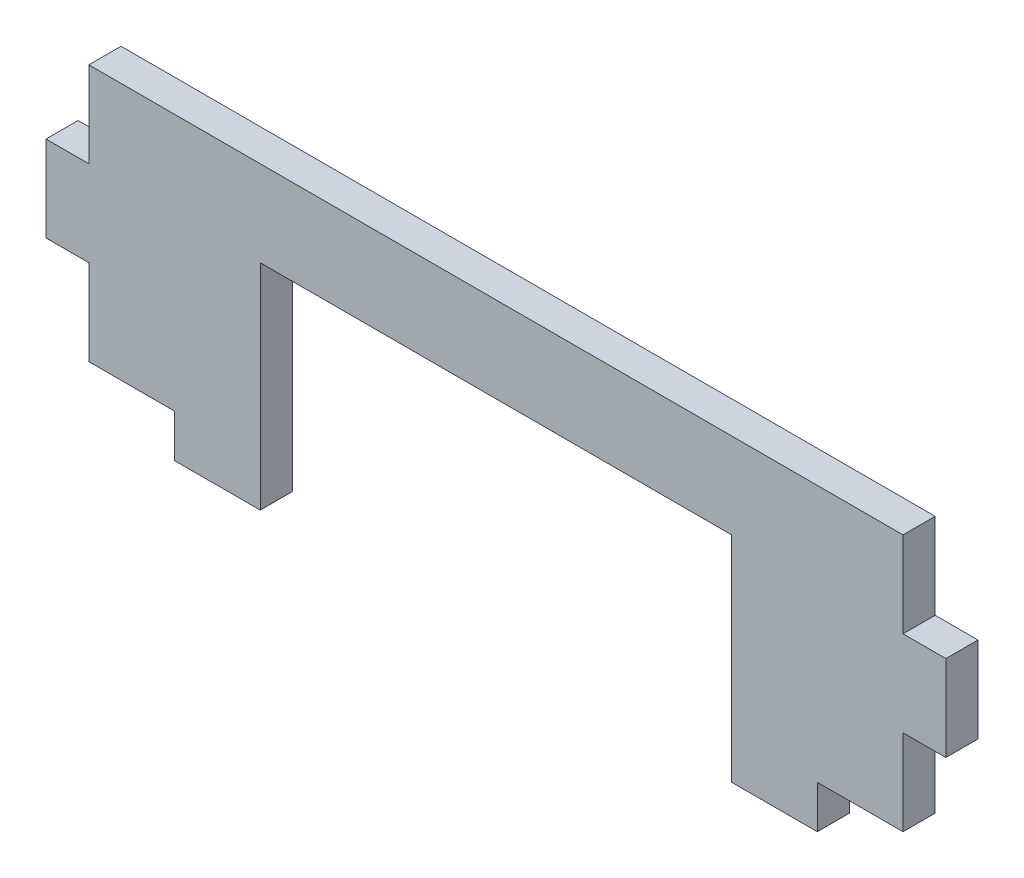
ISO-10303-21;
HEADER;
FILE_DESCRIPTION(('STEP AP214'),'2;1');
FILE_NAME('part.step','',(''),(''),'','','');
FILE_SCHEMA(('AUTOMOTIVE_DESIGN { 1 0 10303 214 1 1 1 1 }'));
ENDSEC;
DATA;
#1=APPLICATION_CONTEXT('core data for automotive mechanical design processes');
#2=APPLICATION_PROTOCOL_DEFINITION('international standard','automotive_design',2000,#1);
#3=PRODUCT_CONTEXT('',#1,'mechanical');
#4=PRODUCT('Part','Part','',(#3));
#5=PRODUCT_RELATED_PRODUCT_CATEGORY('part','',(#4));
#6=PRODUCT_DEFINITION_FORMATION('','',#4);
#7=PRODUCT_DEFINITION_CONTEXT('part definition',#1,'design');
#8=PRODUCT_DEFINITION('design','',#6,#7);
#9=PRODUCT_DEFINITION_SHAPE('','',#8);
#10=(LENGTH_UNIT() NAMED_UNIT(*) SI_UNIT(.MILLI.,.METRE.));
#11=(NAMED_UNIT(*) PLANE_ANGLE_UNIT() SI_UNIT($,.RADIAN.));
#12=(NAMED_UNIT(*) SI_UNIT($,.STERADIAN.) SOLID_ANGLE_UNIT());
#13=UNCERTAINTY_MEASURE_WITH_UNIT(LENGTH_MEASURE(1.E-05),#10,'distance_accuracy_value','');
#14=(GEOMETRIC_REPRESENTATION_CONTEXT(3) GLOBAL_UNCERTAINTY_ASSIGNED_CONTEXT((#13)) GLOBAL_UNIT_ASSIGNED_CONTEXT((#10,
#11,#12)) REPRESENTATION_CONTEXT('',''));
#15=CARTESIAN_POINT('',(0.,0.,0.));
#16=DIRECTION('',(0.,0.,1.));
#17=DIRECTION('',(1.,0.,0.));
#18=AXIS2_PLACEMENT_3D('',#15,#16,#17);
#19=CARTESIAN_POINT('',(-38.,0.,3.));
#20=DIRECTION('',(1.,0.,0.));
#21=DIRECTION('',(0.,0.,-1.));
#22=AXIS2_PLACEMENT_3D('',#19,#20,#21);
#23=PLANE('',#22);
#24=DIRECTION('',(0.,-1.,0.));
#25=VECTOR('',#24,1.);
#26=CARTESIAN_POINT('',(-38.,0.,0.));
#27=LINE('',#26,#25);
#28=CARTESIAN_POINT('',(-38.,0.,0.));
#29=VERTEX_POINT('',#28);
#30=CARTESIAN_POINT('',(-38.,-8.,0.));
#31=VERTEX_POINT('',#30);
#32=EDGE_CURVE('E201',#29,#31,#27,.T.);
#33=ORIENTED_EDGE('',*,*,#32,.T.);
#34=DIRECTION('',(0.,0.,-1.));
#35=VECTOR('',#34,1.);
#36=CARTESIAN_POINT('',(-38.,-8.,3.));
#37=LINE('',#36,#35);
#38=CARTESIAN_POINT('',(-38.,-8.,3.));
#39=VERTEX_POINT('',#38);
#40=EDGE_CURVE('E11',#39,#31,#37,.T.);
#41=ORIENTED_EDGE('',*,*,#40,.F.);
#42=DIRECTION('',(0.,-1.,0.));
#43=VECTOR('',#42,1.);
#44=CARTESIAN_POINT('',(-38.,0.,3.));
#45=LINE('',#44,#43);
#46=CARTESIAN_POINT('',(-38.,0.,3.));
#47=VERTEX_POINT('',#46);
#48=EDGE_CURVE('E241',#47,#39,#45,.T.);
#49=ORIENTED_EDGE('',*,*,#48,.F.);
#50=DIRECTION('',(0.,0.,-1.));
#51=VECTOR('',#50,1.);
#52=CARTESIAN_POINT('',(-38.,0.,3.));
#53=LINE('',#52,#51);
#54=EDGE_CURVE('E197',#47,#29,#53,.T.);
#55=ORIENTED_EDGE('',*,*,#54,.T.);
#56=EDGE_LOOP('',(#33,#41,#49,#55));
#57=FACE_BOUND('',#56,.T.);
#58=ADVANCED_FACE('F33',(#57),#23,.F.);
#59=CARTESIAN_POINT('',(-38.,-8.,3.));
#60=DIRECTION('',(0.,-1.,0.));
#61=DIRECTION('',(1.,0.,0.));
#62=AXIS2_PLACEMENT_3D('',#59,#60,#61);
#63=PLANE('',#62);
#64=DIRECTION('',(-1.,0.,0.));
#65=VECTOR('',#64,1.);
#66=CARTESIAN_POINT('',(-38.,-8.,0.));
#67=LINE('',#66,#65);
#68=CARTESIAN_POINT('',(-42.,-8.,0.));
#69=VERTEX_POINT('',#68);
#70=EDGE_CURVE('E204',#31,#69,#67,.T.);
#71=ORIENTED_EDGE('',*,*,#70,.T.);
#72=DIRECTION('',(0.,0.,-1.));
#73=VECTOR('',#72,1.);
#74=CARTESIAN_POINT('',(-42.,-8.,3.));
#75=LINE('',#74,#73);
#76=CARTESIAN_POINT('',(-42.,-8.,3.));
#77=VERTEX_POINT('',#76);
#78=EDGE_CURVE('E41',#77,#69,#75,.T.);
#79=ORIENTED_EDGE('',*,*,#78,.F.);
#80=DIRECTION('',(-1.,0.,0.));
#81=VECTOR('',#80,1.);
#82=CARTESIAN_POINT('',(-38.,-8.,3.));
#83=LINE('',#82,#81);
#84=EDGE_CURVE('E128',#39,#77,#83,.T.);
#85=ORIENTED_EDGE('',*,*,#84,.F.);
#86=ORIENTED_EDGE('',*,*,#40,.T.);
#87=EDGE_LOOP('',(#71,#79,#85,#86));
#88=FACE_BOUND('',#87,.T.);
#89=ADVANCED_FACE('F359',(#88),#63,.F.);
#90=CARTESIAN_POINT('',(-42.,-8.,3.));
#91=DIRECTION('',(1.,0.,0.));
#92=DIRECTION('',(0.,0.,-1.));
#93=AXIS2_PLACEMENT_3D('',#90,#91,#92);
#94=PLANE('',#93);
#95=DIRECTION('',(0.,-1.,0.));
#96=VECTOR('',#95,1.);
#97=CARTESIAN_POINT('',(-42.,-8.,0.));
#98=LINE('',#97,#96);
#99=CARTESIAN_POINT('',(-42.,-16.,0.));
#100=VERTEX_POINT('',#99);
#101=EDGE_CURVE('E206',#69,#100,#98,.T.);
#102=ORIENTED_EDGE('',*,*,#101,.T.);
#103=DIRECTION('',(0.,0.,-1.));
#104=VECTOR('',#103,1.);
#105=CARTESIAN_POINT('',(-42.,-16.,3.));
#106=LINE('',#105,#104);
#107=CARTESIAN_POINT('',(-42.,-16.,3.));
#108=VERTEX_POINT('',#107);
#109=EDGE_CURVE('E284',#108,#100,#106,.T.);
#110=ORIENTED_EDGE('',*,*,#109,.F.);
#111=DIRECTION('',(0.,-1.,0.));
#112=VECTOR('',#111,1.);
#113=CARTESIAN_POINT('',(-42.,-8.,3.));
#114=LINE('',#113,#112);
#115=EDGE_CURVE('E292',#77,#108,#114,.T.);
#116=ORIENTED_EDGE('',*,*,#115,.F.);
#117=ORIENTED_EDGE('',*,*,#78,.T.);
#118=EDGE_LOOP('',(#102,#110,#116,#117));
#119=FACE_BOUND('',#118,.T.);
#120=ADVANCED_FACE('F290',(#119),#94,.F.);
#121=CARTESIAN_POINT('',(-42.,-16.,3.));
#122=DIRECTION('',(0.,1.,0.));
#123=DIRECTION('',(-1.,0.,0.));
#124=AXIS2_PLACEMENT_3D('',#121,#122,#123);
#125=PLANE('',#124);
#126=DIRECTION('',(1.,0.,0.));
#127=VECTOR('',#126,1.);
#128=CARTESIAN_POINT('',(-42.,-16.,0.));
#129=LINE('',#128,#127);
#130=CARTESIAN_POINT('',(-38.,-16.,0.));
#131=VERTEX_POINT('',#130);
#132=EDGE_CURVE('E208',#100,#131,#129,.T.);
#133=ORIENTED_EDGE('',*,*,#132,.T.);
#134=DIRECTION('',(0.,0.,-1.));
#135=VECTOR('',#134,1.);
#136=CARTESIAN_POINT('',(-38.,-16.,3.));
#137=LINE('',#136,#135);
#138=CARTESIAN_POINT('',(-38.,-16.,3.));
#139=VERTEX_POINT('',#138);
#140=EDGE_CURVE('E281',#139,#131,#137,.T.);
#141=ORIENTED_EDGE('',*,*,#140,.F.);
#142=DIRECTION('',(1.,0.,0.));
#143=VECTOR('',#142,1.);
#144=CARTESIAN_POINT('',(-42.,-16.,3.));
#145=LINE('',#144,#143);
#146=EDGE_CURVE('E310',#108,#139,#145,.T.);
#147=ORIENTED_EDGE('',*,*,#146,.F.);
#148=ORIENTED_EDGE('',*,*,#109,.T.);
#149=EDGE_LOOP('',(#133,#141,#147,#148));
#150=FACE_BOUND('',#149,.T.);
#151=ADVANCED_FACE('F301',(#150),#125,.F.);
#152=CARTESIAN_POINT('',(-38.,-16.,3.));
#153=DIRECTION('',(1.,0.,0.));
#154=DIRECTION('',(0.,1.,0.));
#155=AXIS2_PLACEMENT_3D('',#152,#153,#154);
#156=PLANE('',#155);
#157=DIRECTION('',(0.,-1.,0.));
#158=VECTOR('',#157,1.);
#159=CARTESIAN_POINT('',(-38.,-16.,0.));
#160=LINE('',#159,#158);
#161=CARTESIAN_POINT('',(-38.,-24.,0.));
#162=VERTEX_POINT('',#161);
#163=EDGE_CURVE('E210',#131,#162,#160,.T.);
#164=ORIENTED_EDGE('',*,*,#163,.T.);
#165=DIRECTION('',(0.,0.,-1.));
#166=VECTOR('',#165,1.);
#167=CARTESIAN_POINT('',(-38.,-24.,3.));
#168=LINE('',#167,#166);
#169=CARTESIAN_POINT('',(-38.,-24.,3.));
#170=VERTEX_POINT('',#169);
#171=EDGE_CURVE('E278',#170,#162,#168,.T.);
#172=ORIENTED_EDGE('',*,*,#171,.F.);
#173=DIRECTION('',(0.,-1.,0.));
#174=VECTOR('',#173,1.);
#175=CARTESIAN_POINT('',(-38.,-16.,3.));
#176=LINE('',#175,#174);
#177=EDGE_CURVE('E307',#139,#170,#176,.T.);
#178=ORIENTED_EDGE('',*,*,#177,.F.);
#179=ORIENTED_EDGE('',*,*,#140,.T.);
#180=EDGE_LOOP('',(#164,#172,#178,#179));
#181=FACE_BOUND('',#180,.T.);
#182=ADVANCED_FACE('F305',(#181),#156,.F.);
#183=CARTESIAN_POINT('',(-38.,-24.,3.));
#184=DIRECTION('',(0.,1.,0.));
#185=DIRECTION('',(0.,0.,1.));
#186=AXIS2_PLACEMENT_3D('',#183,#184,#185);
#187=PLANE('',#186);
#188=DIRECTION('',(1.,0.,0.));
#189=VECTOR('',#188,1.);
#190=CARTESIAN_POINT('',(-38.,-24.,0.));
#191=LINE('',#190,#189);
#192=CARTESIAN_POINT('',(-30.,-24.,0.));
#193=VERTEX_POINT('',#192);
#194=EDGE_CURVE('E212',#162,#193,#191,.T.);
#195=ORIENTED_EDGE('',*,*,#194,.T.);
#196=DIRECTION('',(0.,0.,-1.));
#197=VECTOR('',#196,1.);
#198=CARTESIAN_POINT('',(-30.,-24.,3.));
#199=LINE('',#198,#197);
#200=CARTESIAN_POINT('',(-30.,-24.,3.));
#201=VERTEX_POINT('',#200);
#202=EDGE_CURVE('E275',#201,#193,#199,.T.);
#203=ORIENTED_EDGE('',*,*,#202,.F.);
#204=DIRECTION('',(1.,0.,0.));
#205=VECTOR('',#204,1.);
#206=CARTESIAN_POINT('',(-38.,-24.,3.));
#207=LINE('',#206,#205);
#208=EDGE_CURVE('E309',#170,#201,#207,.T.);
#209=ORIENTED_EDGE('',*,*,#208,.F.);
#210=ORIENTED_EDGE('',*,*,#171,.T.);
#211=EDGE_LOOP('',(#195,#203,#209,#210));
#212=FACE_BOUND('',#211,.T.);
#213=ADVANCED_FACE('F372',(#212),#187,.F.);
#214=CARTESIAN_POINT('',(-30.,-24.,3.));
#215=DIRECTION('',(1.,0.,0.));
#216=DIRECTION('',(0.,0.,-1.));
#217=AXIS2_PLACEMENT_3D('',#214,#215,#216);
#218=PLANE('',#217);
#219=DIRECTION('',(0.,-1.,0.));
#220=VECTOR('',#219,1.);
#221=CARTESIAN_POINT('',(-30.,-24.,0.));
#222=LINE('',#221,#220);
#223=CARTESIAN_POINT('',(-30.,-28.,0.));
#224=VERTEX_POINT('',#223);
#225=EDGE_CURVE('E214',#193,#224,#222,.T.);
#226=ORIENTED_EDGE('',*,*,#225,.T.);
#227=DIRECTION('',(0.,0.,-1.));
#228=VECTOR('',#227,1.);
#229=CARTESIAN_POINT('',(-30.,-28.,3.));
#230=LINE('',#229,#228);
#231=CARTESIAN_POINT('',(-30.,-28.,3.));
#232=VERTEX_POINT('',#231);
#233=EDGE_CURVE('E272',#232,#224,#230,.T.);
#234=ORIENTED_EDGE('',*,*,#233,.F.);
#235=DIRECTION('',(0.,-1.,0.));
#236=VECTOR('',#235,1.);
#237=CARTESIAN_POINT('',(-30.,-24.,3.));
#238=LINE('',#237,#236);
#239=EDGE_CURVE('E312',#201,#232,#238,.T.);
#240=ORIENTED_EDGE('',*,*,#239,.F.);
#241=ORIENTED_EDGE('',*,*,#202,.T.);
#242=EDGE_LOOP('',(#226,#234,#240,#241));
#243=FACE_BOUND('',#242,.T.);
#244=ADVANCED_FACE('F375',(#243),#218,.F.);
#245=CARTESIAN_POINT('',(-30.,-28.,3.));
#246=DIRECTION('',(0.,1.,0.));
#247=DIRECTION('',(0.,0.,1.));
#248=AXIS2_PLACEMENT_3D('',#245,#246,#247);
#249=PLANE('',#248);
#250=DIRECTION('',(1.,0.,0.));
#251=VECTOR('',#250,1.);
#252=CARTESIAN_POINT('',(-30.,-28.,0.));
#253=LINE('',#252,#251);
#254=CARTESIAN_POINT('',(-22.,-28.,0.));
#255=VERTEX_POINT('',#254);
#256=EDGE_CURVE('E216',#224,#255,#253,.T.);
#257=ORIENTED_EDGE('',*,*,#256,.T.);
#258=DIRECTION('',(0.,0.,-1.));
#259=VECTOR('',#258,1.);
#260=CARTESIAN_POINT('',(-22.,-28.,3.));
#261=LINE('',#260,#259);
#262=CARTESIAN_POINT('',(-22.,-28.,3.));
#263=VERTEX_POINT('',#262);
#264=EDGE_CURVE('E269',#263,#255,#261,.T.);
#265=ORIENTED_EDGE('',*,*,#264,.F.);
#266=DIRECTION('',(1.,0.,0.));
#267=VECTOR('',#266,1.);
#268=CARTESIAN_POINT('',(-30.,-28.,3.));
#269=LINE('',#268,#267);
#270=EDGE_CURVE('E318',#232,#263,#269,.T.);
#271=ORIENTED_EDGE('',*,*,#270,.F.);
#272=ORIENTED_EDGE('',*,*,#233,.T.);
#273=EDGE_LOOP('',(#257,#265,#271,#272));
#274=FACE_BOUND('',#273,.T.);
#275=ADVANCED_FACE('F379',(#274),#249,.F.);
#276=CARTESIAN_POINT('',(-22.,-16.,3.));
#277=DIRECTION('',(-1.,0.,0.));
#278=DIRECTION('',(0.,0.,1.));
#279=AXIS2_PLACEMENT_3D('',#276,#277,#278);
#280=PLANE('',#279);
#281=DIRECTION('',(0.,1.,0.));
#282=VECTOR('',#281,1.);
#283=CARTESIAN_POINT('',(-22.,-16.,0.));
#284=LINE('',#283,#282);
#285=CARTESIAN_POINT('',(-22.,-8.,0.));
#286=VERTEX_POINT('',#285);
#287=EDGE_CURVE('E219',#255,#286,#284,.T.);
#288=ORIENTED_EDGE('',*,*,#287,.T.);
#289=DIRECTION('',(0.,0.,-1.));
#290=VECTOR('',#289,1.);
#291=CARTESIAN_POINT('',(-22.,-8.,3.));
#292=LINE('',#291,#290);
#293=CARTESIAN_POINT('',(-22.,-8.,3.));
#294=VERTEX_POINT('',#293);
#295=EDGE_CURVE('E266',#294,#286,#292,.T.);
#296=ORIENTED_EDGE('',*,*,#295,.F.);
#297=DIRECTION('',(0.,1.,0.));
#298=VECTOR('',#297,1.);
#299=CARTESIAN_POINT('',(-22.,-28.,3.));
#300=LINE('',#299,#298);
#301=EDGE_CURVE('E320',#263,#294,#300,.T.);
#302=ORIENTED_EDGE('',*,*,#301,.F.);
#303=ORIENTED_EDGE('',*,*,#264,.T.);
#304=EDGE_LOOP('',(#288,#296,#302,#303));
#305=FACE_BOUND('',#304,.T.);
#306=ADVANCED_FACE('F383',(#305),#280,.F.);
#307=CARTESIAN_POINT('',(22.,-8.,3.));
#308=DIRECTION('',(0.,1.,0.));
#309=DIRECTION('',(0.,0.,1.));
#310=AXIS2_PLACEMENT_3D('',#307,#308,#309);
#311=PLANE('',#310);
#312=DIRECTION('',(1.,0.,0.));
#313=VECTOR('',#312,1.);
#314=CARTESIAN_POINT('',(22.,-8.,0.));
#315=LINE('',#314,#313);
#316=CARTESIAN_POINT('',(22.,-8.,0.));
#317=VERTEX_POINT('',#316);
#318=EDGE_CURVE('E221',#286,#317,#315,.T.);
#319=ORIENTED_EDGE('',*,*,#318,.T.);
#320=DIRECTION('',(0.,0.,-1.));
#321=VECTOR('',#320,1.);
#322=CARTESIAN_POINT('',(22.,-8.,3.));
#323=LINE('',#322,#321);
#324=CARTESIAN_POINT('',(22.,-8.,3.));
#325=VERTEX_POINT('',#324);
#326=EDGE_CURVE('E263',#325,#317,#323,.T.);
#327=ORIENTED_EDGE('',*,*,#326,.F.);
#328=DIRECTION('',(1.,0.,0.));
#329=VECTOR('',#328,1.);
#330=CARTESIAN_POINT('',(22.,-8.,3.));
#331=LINE('',#330,#329);
#332=EDGE_CURVE('E322',#294,#325,#331,.T.);
#333=ORIENTED_EDGE('',*,*,#332,.F.);
#334=ORIENTED_EDGE('',*,*,#295,.T.);
#335=EDGE_LOOP('',(#319,#327,#333,#334));
#336=FACE_BOUND('',#335,.T.);
#337=ADVANCED_FACE('F387',(#336),#311,.F.);
#338=CARTESIAN_POINT('',(22.,-28.,3.));
#339=DIRECTION('',(1.,0.,0.));
#340=DIRECTION('',(0.,0.,-1.));
#341=AXIS2_PLACEMENT_3D('',#338,#339,#340);
#342=PLANE('',#341);
#343=DIRECTION('',(0.,-1.,0.));
#344=VECTOR('',#343,1.);
#345=CARTESIAN_POINT('',(22.,-28.,0.));
#346=LINE('',#345,#344);
#347=CARTESIAN_POINT('',(22.,-28.,0.));
#348=VERTEX_POINT('',#347);
#349=EDGE_CURVE('E224',#317,#348,#346,.T.);
#350=ORIENTED_EDGE('',*,*,#349,.T.);
#351=DIRECTION('',(0.,0.,-1.));
#352=VECTOR('',#351,1.);
#353=CARTESIAN_POINT('',(22.,-28.,3.));
#354=LINE('',#353,#352);
#355=CARTESIAN_POINT('',(22.,-28.,3.));
#356=VERTEX_POINT('',#355);
#357=EDGE_CURVE('E260',#356,#348,#354,.T.);
#358=ORIENTED_EDGE('',*,*,#357,.F.);
#359=DIRECTION('',(0.,-1.,0.));
#360=VECTOR('',#359,1.);
#361=CARTESIAN_POINT('',(22.,-16.,3.));
#362=LINE('',#361,#360);
#363=EDGE_CURVE('E324',#325,#356,#362,.T.);
#364=ORIENTED_EDGE('',*,*,#363,.F.);
#365=ORIENTED_EDGE('',*,*,#326,.T.);
#366=EDGE_LOOP('',(#350,#358,#364,#365));
#367=FACE_BOUND('',#366,.T.);
#368=ADVANCED_FACE('F391',(#367),#342,.F.);
#369=CARTESIAN_POINT('',(30.,-28.,3.));
#370=DIRECTION('',(0.,1.,0.));
#371=DIRECTION('',(0.,0.,1.));
#372=AXIS2_PLACEMENT_3D('',#369,#370,#371);
#373=PLANE('',#372);
#374=DIRECTION('',(1.,0.,0.));
#375=VECTOR('',#374,1.);
#376=CARTESIAN_POINT('',(30.,-28.,0.));
#377=LINE('',#376,#375);
#378=CARTESIAN_POINT('',(30.,-28.,0.));
#379=VERTEX_POINT('',#378);
#380=EDGE_CURVE('E226',#348,#379,#377,.T.);
#381=ORIENTED_EDGE('',*,*,#380,.T.);
#382=DIRECTION('',(0.,0.,-1.));
#383=VECTOR('',#382,1.);
#384=CARTESIAN_POINT('',(30.,-28.,3.));
#385=LINE('',#384,#383);
#386=CARTESIAN_POINT('',(30.,-28.,3.));
#387=VERTEX_POINT('',#386);
#388=EDGE_CURVE('E257',#387,#379,#385,.T.);
#389=ORIENTED_EDGE('',*,*,#388,.F.);
#390=DIRECTION('',(1.,0.,0.));
#391=VECTOR('',#390,1.);
#392=CARTESIAN_POINT('',(30.,-28.,3.));
#393=LINE('',#392,#391);
#394=EDGE_CURVE('E326',#356,#387,#393,.T.);
#395=ORIENTED_EDGE('',*,*,#394,.F.);
#396=ORIENTED_EDGE('',*,*,#357,.T.);
#397=EDGE_LOOP('',(#381,#389,#395,#396));
#398=FACE_BOUND('',#397,.T.);
#399=ADVANCED_FACE('F395',(#398),#373,.F.);
#400=CARTESIAN_POINT('',(30.,-24.,3.));
#401=DIRECTION('',(-1.,0.,0.));
#402=DIRECTION('',(0.,0.,1.));
#403=AXIS2_PLACEMENT_3D('',#400,#401,#402);
#404=PLANE('',#403);
#405=DIRECTION('',(0.,1.,0.));
#406=VECTOR('',#405,1.);
#407=CARTESIAN_POINT('',(30.,-24.,0.));
#408=LINE('',#407,#406);
#409=CARTESIAN_POINT('',(30.,-24.,0.));
#410=VERTEX_POINT('',#409);
#411=EDGE_CURVE('E228',#379,#410,#408,.T.);
#412=ORIENTED_EDGE('',*,*,#411,.T.);
#413=DIRECTION('',(0.,0.,-1.));
#414=VECTOR('',#413,1.);
#415=CARTESIAN_POINT('',(30.,-24.,3.));
#416=LINE('',#415,#414);
#417=CARTESIAN_POINT('',(30.,-24.,3.));
#418=VERTEX_POINT('',#417);
#419=EDGE_CURVE('E254',#418,#410,#416,.T.);
#420=ORIENTED_EDGE('',*,*,#419,.F.);
#421=DIRECTION('',(0.,1.,0.));
#422=VECTOR('',#421,1.);
#423=CARTESIAN_POINT('',(30.,-24.,3.));
#424=LINE('',#423,#422);
#425=EDGE_CURVE('E328',#387,#418,#424,.T.);
#426=ORIENTED_EDGE('',*,*,#425,.F.);
#427=ORIENTED_EDGE('',*,*,#388,.T.);
#428=EDGE_LOOP('',(#412,#420,#426,#427));
#429=FACE_BOUND('',#428,.T.);
#430=ADVANCED_FACE('F399',(#429),#404,.F.);
#431=CARTESIAN_POINT('',(38.,-24.,3.));
#432=DIRECTION('',(0.,1.,0.));
#433=DIRECTION('',(0.,0.,1.));
#434=AXIS2_PLACEMENT_3D('',#431,#432,#433);
#435=PLANE('',#434);
#436=DIRECTION('',(1.,0.,0.));
#437=VECTOR('',#436,1.);
#438=CARTESIAN_POINT('',(38.,-24.,0.));
#439=LINE('',#438,#437);
#440=CARTESIAN_POINT('',(38.,-24.,0.));
#441=VERTEX_POINT('',#440);
#442=EDGE_CURVE('E230',#410,#441,#439,.T.);
#443=ORIENTED_EDGE('',*,*,#442,.T.);
#444=DIRECTION('',(0.,0.,-1.));
#445=VECTOR('',#444,1.);
#446=CARTESIAN_POINT('',(38.,-24.,3.));
#447=LINE('',#446,#445);
#448=CARTESIAN_POINT('',(38.,-24.,3.));
#449=VERTEX_POINT('',#448);
#450=EDGE_CURVE('E251',#449,#441,#447,.T.);
#451=ORIENTED_EDGE('',*,*,#450,.F.);
#452=DIRECTION('',(1.,0.,0.));
#453=VECTOR('',#452,1.);
#454=CARTESIAN_POINT('',(38.,-24.,3.));
#455=LINE('',#454,#453);
#456=EDGE_CURVE('E330',#418,#449,#455,.T.);
#457=ORIENTED_EDGE('',*,*,#456,.F.);
#458=ORIENTED_EDGE('',*,*,#419,.T.);
#459=EDGE_LOOP('',(#443,#451,#457,#458));
#460=FACE_BOUND('',#459,.T.);
#461=ADVANCED_FACE('F403',(#460),#435,.F.);
#462=CARTESIAN_POINT('',(38.,-16.,3.));
#463=DIRECTION('',(-1.,0.,0.));
#464=DIRECTION('',(0.,-1.,0.));
#465=AXIS2_PLACEMENT_3D('',#462,#463,#464);
#466=PLANE('',#465);
#467=DIRECTION('',(0.,1.,0.));
#468=VECTOR('',#467,1.);
#469=CARTESIAN_POINT('',(38.,-16.,0.));
#470=LINE('',#469,#468);
#471=CARTESIAN_POINT('',(38.,-16.,0.));
#472=VERTEX_POINT('',#471);
#473=EDGE_CURVE('E232',#441,#472,#470,.T.);
#474=ORIENTED_EDGE('',*,*,#473,.T.);
#475=DIRECTION('',(0.,0.,-1.));
#476=VECTOR('',#475,1.);
#477=CARTESIAN_POINT('',(38.,-16.,3.));
#478=LINE('',#477,#476);
#479=CARTESIAN_POINT('',(38.,-16.,3.));
#480=VERTEX_POINT('',#479);
#481=EDGE_CURVE('E248',#480,#472,#478,.T.);
#482=ORIENTED_EDGE('',*,*,#481,.F.);
#483=DIRECTION('',(0.,1.,0.));
#484=VECTOR('',#483,1.);
#485=CARTESIAN_POINT('',(38.,-16.,3.));
#486=LINE('',#485,#484);
#487=EDGE_CURVE('E332',#449,#480,#486,.T.);
#488=ORIENTED_EDGE('',*,*,#487,.F.);
#489=ORIENTED_EDGE('',*,*,#450,.T.);
#490=EDGE_LOOP('',(#474,#482,#488,#489));
#491=FACE_BOUND('',#490,.T.);
#492=ADVANCED_FACE('F407',(#491),#466,.F.);
#493=CARTESIAN_POINT('',(42.,-16.,3.));
#494=DIRECTION('',(0.,1.,0.));
#495=DIRECTION('',(-1.,0.,0.));
#496=AXIS2_PLACEMENT_3D('',#493,#494,#495);
#497=PLANE('',#496);
#498=DIRECTION('',(1.,0.,0.));
#499=VECTOR('',#498,1.);
#500=CARTESIAN_POINT('',(42.,-16.,0.));
#501=LINE('',#500,#499);
#502=CARTESIAN_POINT('',(42.,-16.,0.));
#503=VERTEX_POINT('',#502);
#504=EDGE_CURVE('E234',#472,#503,#501,.T.);
#505=ORIENTED_EDGE('',*,*,#504,.T.);
#506=DIRECTION('',(0.,0.,-1.));
#507=VECTOR('',#506,1.);
#508=CARTESIAN_POINT('',(42.,-16.,3.));
#509=LINE('',#508,#507);
#510=CARTESIAN_POINT('',(42.,-16.,3.));
#511=VERTEX_POINT('',#510);
#512=EDGE_CURVE('E245',#511,#503,#509,.T.);
#513=ORIENTED_EDGE('',*,*,#512,.F.);
#514=DIRECTION('',(1.,0.,0.));
#515=VECTOR('',#514,1.);
#516=CARTESIAN_POINT('',(42.,-16.,3.));
#517=LINE('',#516,#515);
#518=EDGE_CURVE('E334',#480,#511,#517,.T.);
#519=ORIENTED_EDGE('',*,*,#518,.F.);
#520=ORIENTED_EDGE('',*,*,#481,.T.);
#521=EDGE_LOOP('',(#505,#513,#519,#520));
#522=FACE_BOUND('',#521,.T.);
#523=ADVANCED_FACE('F340',(#522),#497,.F.);
#524=CARTESIAN_POINT('',(42.,-8.,3.));
#525=DIRECTION('',(-1.,0.,0.));
#526=DIRECTION('',(0.,0.,1.));
#527=AXIS2_PLACEMENT_3D('',#524,#525,#526);
#528=PLANE('',#527);
#529=DIRECTION('',(0.,1.,0.));
#530=VECTOR('',#529,1.);
#531=CARTESIAN_POINT('',(42.,-8.,0.));
#532=LINE('',#531,#530);
#533=CARTESIAN_POINT('',(42.,-8.,0.));
#534=VERTEX_POINT('',#533);
#535=EDGE_CURVE('E236',#503,#534,#532,.T.);
#536=ORIENTED_EDGE('',*,*,#535,.T.);
#537=DIRECTION('',(0.,0.,-1.));
#538=VECTOR('',#537,1.);
#539=CARTESIAN_POINT('',(42.,-8.,3.));
#540=LINE('',#539,#538);
#541=CARTESIAN_POINT('',(42.,-8.,3.));
#542=VERTEX_POINT('',#541);
#543=EDGE_CURVE('E192',#542,#534,#540,.T.);
#544=ORIENTED_EDGE('',*,*,#543,.F.);
#545=DIRECTION('',(0.,1.,0.));
#546=VECTOR('',#545,1.);
#547=CARTESIAN_POINT('',(42.,-8.,3.));
#548=LINE('',#547,#546);
#549=EDGE_CURVE('E183',#511,#542,#548,.T.);
#550=ORIENTED_EDGE('',*,*,#549,.F.);
#551=ORIENTED_EDGE('',*,*,#512,.T.);
#552=EDGE_LOOP('',(#536,#544,#550,#551));
#553=FACE_BOUND('',#552,.T.);
#554=ADVANCED_FACE('F344',(#553),#528,.F.);
#555=CARTESIAN_POINT('',(38.,-8.,3.));
#556=DIRECTION('',(0.,-1.,0.));
#557=DIRECTION('',(1.,0.,0.));
#558=AXIS2_PLACEMENT_3D('',#555,#556,#557);
#559=PLANE('',#558);
#560=DIRECTION('',(-1.,0.,0.));
#561=VECTOR('',#560,1.);
#562=CARTESIAN_POINT('',(38.,-8.,0.));
#563=LINE('',#562,#561);
#564=CARTESIAN_POINT('',(38.,-8.,0.));
#565=VERTEX_POINT('',#564);
#566=EDGE_CURVE('E191',#534,#565,#563,.T.);
#567=ORIENTED_EDGE('',*,*,#566,.T.);
#568=DIRECTION('',(0.,0.,-1.));
#569=VECTOR('',#568,1.);
#570=CARTESIAN_POINT('',(38.,-8.,3.));
#571=LINE('',#570,#569);
#572=CARTESIAN_POINT('',(38.,-8.,3.));
#573=VERTEX_POINT('',#572);
#574=EDGE_CURVE('E188',#573,#565,#571,.T.);
#575=ORIENTED_EDGE('',*,*,#574,.F.);
#576=DIRECTION('',(-1.,0.,0.));
#577=VECTOR('',#576,1.);
#578=CARTESIAN_POINT('',(38.,-8.,3.));
#579=LINE('',#578,#577);
#580=EDGE_CURVE('E177',#542,#573,#579,.T.);
#581=ORIENTED_EDGE('',*,*,#580,.F.);
#582=ORIENTED_EDGE('',*,*,#543,.T.);
#583=EDGE_LOOP('',(#567,#575,#581,#582));
#584=FACE_BOUND('',#583,.T.);
#585=ADVANCED_FACE('F189',(#584),#559,.F.);
#586=CARTESIAN_POINT('',(38.,0.,3.));
#587=DIRECTION('',(-1.,0.,0.));
#588=DIRECTION('',(0.,0.,1.));
#589=AXIS2_PLACEMENT_3D('',#586,#587,#588);
#590=PLANE('',#589);
#591=DIRECTION('',(0.,1.,0.));
#592=VECTOR('',#591,1.);
#593=CARTESIAN_POINT('',(38.,0.,0.));
#594=LINE('',#593,#592);
#595=CARTESIAN_POINT('',(38.,0.,0.));
#596=VERTEX_POINT('',#595);
#597=EDGE_CURVE('E114',#565,#596,#594,.T.);
#598=ORIENTED_EDGE('',*,*,#597,.T.);
#599=DIRECTION('',(0.,0.,-1.));
#600=VECTOR('',#599,1.);
#601=CARTESIAN_POINT('',(38.,0.,3.));
#602=LINE('',#601,#600);
#603=CARTESIAN_POINT('',(38.,0.,3.));
#604=VERTEX_POINT('',#603);
#605=EDGE_CURVE('E193',#604,#596,#602,.T.);
#606=ORIENTED_EDGE('',*,*,#605,.F.);
#607=DIRECTION('',(0.,1.,0.));
#608=VECTOR('',#607,1.);
#609=CARTESIAN_POINT('',(38.,0.,3.));
#610=LINE('',#609,#608);
#611=EDGE_CURVE('E181',#573,#604,#610,.T.);
#612=ORIENTED_EDGE('',*,*,#611,.F.);
#613=ORIENTED_EDGE('',*,*,#574,.T.);
#614=EDGE_LOOP('',(#598,#606,#612,#613));
#615=FACE_BOUND('',#614,.T.);
#616=ADVANCED_FACE('F195',(#615),#590,.F.);
#617=CARTESIAN_POINT('',(-38.,0.,3.));
#618=DIRECTION('',(0.,-1.,0.));
#619=DIRECTION('',(0.,0.,-1.));
#620=AXIS2_PLACEMENT_3D('',#617,#618,#619);
#621=PLANE('',#620);
#622=DIRECTION('',(-1.,0.,0.));
#623=VECTOR('',#622,1.);
#624=CARTESIAN_POINT('',(-38.,0.,0.));
#625=LINE('',#624,#623);
#626=EDGE_CURVE('E120',#596,#29,#625,.T.);
#627=ORIENTED_EDGE('',*,*,#626,.T.);
#628=ORIENTED_EDGE('',*,*,#54,.F.);
#629=DIRECTION('',(-1.,0.,0.));
#630=VECTOR('',#629,1.);
#631=CARTESIAN_POINT('',(-38.,0.,3.));
#632=LINE('',#631,#630);
#633=EDGE_CURVE('E49',#604,#47,#632,.T.);
#634=ORIENTED_EDGE('',*,*,#633,.F.);
#635=ORIENTED_EDGE('',*,*,#605,.T.);
#636=EDGE_LOOP('',(#627,#628,#634,#635));
#637=FACE_BOUND('',#636,.T.);
#638=ADVANCED_FACE('F348',(#637),#621,.F.);
#639=CARTESIAN_POINT('',(0.,0.,3.));
#640=DIRECTION('',(0.,0.,-1.));
#641=DIRECTION('',(-1.,0.,0.));
#642=AXIS2_PLACEMENT_3D('',#639,#640,#641);
#643=PLANE('',#642);
#644=ORIENTED_EDGE('',*,*,#48,.T.);
#645=ORIENTED_EDGE('',*,*,#84,.T.);
#646=ORIENTED_EDGE('',*,*,#115,.T.);
#647=ORIENTED_EDGE('',*,*,#146,.T.);
#648=ORIENTED_EDGE('',*,*,#177,.T.);
#649=ORIENTED_EDGE('',*,*,#208,.T.);
#650=ORIENTED_EDGE('',*,*,#239,.T.);
#651=ORIENTED_EDGE('',*,*,#270,.T.);
#652=ORIENTED_EDGE('',*,*,#301,.T.);
#653=ORIENTED_EDGE('',*,*,#332,.T.);
#654=ORIENTED_EDGE('',*,*,#363,.T.);
#655=ORIENTED_EDGE('',*,*,#394,.T.);
#656=ORIENTED_EDGE('',*,*,#425,.T.);
#657=ORIENTED_EDGE('',*,*,#456,.T.);
#658=ORIENTED_EDGE('',*,*,#487,.T.);
#659=ORIENTED_EDGE('',*,*,#518,.T.);
#660=ORIENTED_EDGE('',*,*,#549,.T.);
#661=ORIENTED_EDGE('',*,*,#580,.T.);
#662=ORIENTED_EDGE('',*,*,#611,.T.);
#663=ORIENTED_EDGE('',*,*,#633,.T.);
#664=EDGE_LOOP('',(#644,#645,#646,#647,#648,#649,#650,#651,#652,#653,#654,#655,#656,#657,#658,
#659,#660,#661,#662,#663));
#665=FACE_BOUND('',#664,.T.);
#666=ADVANCED_FACE('F179',(#665),#643,.F.);
#667=CARTESIAN_POINT('',(0.,0.,0.));
#668=DIRECTION('',(0.,0.,-1.));
#669=DIRECTION('',(-1.,0.,0.));
#670=AXIS2_PLACEMENT_3D('',#667,#668,#669);
#671=PLANE('',#670);
#672=ORIENTED_EDGE('',*,*,#32,.F.);
#673=ORIENTED_EDGE('',*,*,#626,.F.);
#674=ORIENTED_EDGE('',*,*,#597,.F.);
#675=ORIENTED_EDGE('',*,*,#566,.F.);
#676=ORIENTED_EDGE('',*,*,#535,.F.);
#677=ORIENTED_EDGE('',*,*,#504,.F.);
#678=ORIENTED_EDGE('',*,*,#473,.F.);
#679=ORIENTED_EDGE('',*,*,#442,.F.);
#680=ORIENTED_EDGE('',*,*,#411,.F.);
#681=ORIENTED_EDGE('',*,*,#380,.F.);
#682=ORIENTED_EDGE('',*,*,#349,.F.);
#683=ORIENTED_EDGE('',*,*,#318,.F.);
#684=ORIENTED_EDGE('',*,*,#287,.F.);
#685=ORIENTED_EDGE('',*,*,#256,.F.);
#686=ORIENTED_EDGE('',*,*,#225,.F.);
#687=ORIENTED_EDGE('',*,*,#194,.F.);
#688=ORIENTED_EDGE('',*,*,#163,.F.);
#689=ORIENTED_EDGE('',*,*,#132,.F.);
#690=ORIENTED_EDGE('',*,*,#101,.F.);
#691=ORIENTED_EDGE('',*,*,#70,.F.);
#692=EDGE_LOOP('',(#672,#673,#674,#675,#676,#677,#678,#679,#680,#681,#682,#683,#684,#685,#686,
#687,#688,#689,#690,#691));
#693=FACE_BOUND('',#692,.T.);
#694=ADVANCED_FACE('F296',(#693),#671,.T.);
#695=CLOSED_SHELL('',(#58,#89,#120,#151,#182,#213,#244,#275,#306,#337,#368,#399,#430,#461,#492,
#523,#554,#585,#616,#638,#666,#694));
#696=MANIFOLD_SOLID_BREP('B2',#695);
#697=ADVANCED_BREP_SHAPE_REPRESENTATION('',(#18,#696),#14);
#698=SHAPE_DEFINITION_REPRESENTATION(#9,#697);
ENDSEC;
END-ISO-10303-21;
